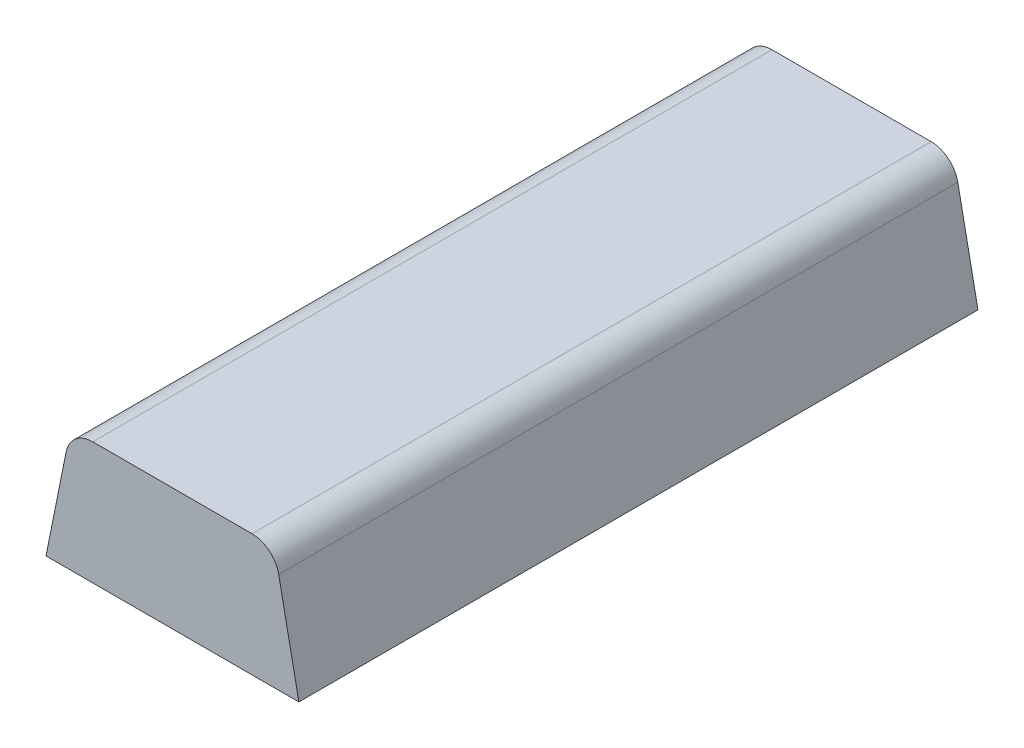
ISO-10303-21;
HEADER;
FILE_DESCRIPTION(('STEP AP214'),'2;1');
FILE_NAME('part.step','',(''),(''),'','','');
FILE_SCHEMA(('AUTOMOTIVE_DESIGN { 1 0 10303 214 1 1 1 1 }'));
ENDSEC;
DATA;
#1=APPLICATION_CONTEXT('core data for automotive mechanical design processes');
#2=APPLICATION_PROTOCOL_DEFINITION('international standard','automotive_design',2000,#1);
#3=PRODUCT_CONTEXT('',#1,'mechanical');
#4=PRODUCT('Part','Part','',(#3));
#5=PRODUCT_RELATED_PRODUCT_CATEGORY('part','',(#4));
#6=PRODUCT_DEFINITION_FORMATION('','',#4);
#7=PRODUCT_DEFINITION_CONTEXT('part definition',#1,'design');
#8=PRODUCT_DEFINITION('design','',#6,#7);
#9=PRODUCT_DEFINITION_SHAPE('','',#8);
#10=(LENGTH_UNIT() NAMED_UNIT(*) SI_UNIT(.MILLI.,.METRE.));
#11=(NAMED_UNIT(*) PLANE_ANGLE_UNIT() SI_UNIT($,.RADIAN.));
#12=(NAMED_UNIT(*) SI_UNIT($,.STERADIAN.) SOLID_ANGLE_UNIT());
#13=UNCERTAINTY_MEASURE_WITH_UNIT(LENGTH_MEASURE(1.E-05),#10,'distance_accuracy_value','');
#14=(GEOMETRIC_REPRESENTATION_CONTEXT(3) GLOBAL_UNCERTAINTY_ASSIGNED_CONTEXT((#13)) GLOBAL_UNIT_ASSIGNED_CONTEXT((#10,
#11,#12)) REPRESENTATION_CONTEXT('',''));
#15=CARTESIAN_POINT('',(0.,0.,0.));
#16=DIRECTION('',(0.,0.,1.));
#17=DIRECTION('',(1.,0.,0.));
#18=AXIS2_PLACEMENT_3D('',#15,#16,#17);
#19=CARTESIAN_POINT('',(2.3447932362444,1.05,0.));
#20=DIRECTION('',(0.,0.,-1.));
#21=DIRECTION('',(-1.,0.,0.));
#22=AXIS2_PLACEMENT_3D('',#19,#20,#21);
#23=CYLINDRICAL_SURFACE('',#22,0.8);
#24=CARTESIAN_POINT('',(2.3447932362444,1.05,10.));
#25=DIRECTION('',(0.,0.,-1.));
#26=DIRECTION('',(-1.,0.,0.));
#27=AXIS2_PLACEMENT_3D('',#24,#25,#26);
#28=CIRCLE('',#27,0.8);
#29=CARTESIAN_POINT('',(2.3447932362444,1.85,10.));
#30=VERTEX_POINT('',#29);
#31=CARTESIAN_POINT('',(3.12910808776642,1.207639505461,10.));
#32=VERTEX_POINT('',#31);
#33=EDGE_CURVE('E78',#30,#32,#28,.T.);
#34=ORIENTED_EDGE('',*,*,#33,.T.);
#35=DIRECTION('',(0.,0.,1.));
#36=VECTOR('',#35,1.);
#37=CARTESIAN_POINT('',(3.12910808776642,1.207639505461,0.));
#38=LINE('',#37,#36);
#39=CARTESIAN_POINT('',(3.12910808776642,1.207639505461,-10.));
#40=VERTEX_POINT('',#39);
#41=EDGE_CURVE('E76',#40,#32,#38,.T.);
#42=ORIENTED_EDGE('',*,*,#41,.F.);
#43=CARTESIAN_POINT('',(2.3447932362444,1.05,-10.));
#44=DIRECTION('',(0.,0.,-1.));
#45=DIRECTION('',(-1.,0.,0.));
#46=AXIS2_PLACEMENT_3D('',#43,#44,#45);
#47=CIRCLE('',#46,0.8);
#48=CARTESIAN_POINT('',(2.3447932362444,1.85,-10.));
#49=VERTEX_POINT('',#48);
#50=EDGE_CURVE('E20',#40,#49,#47,.F.);
#51=ORIENTED_EDGE('',*,*,#50,.T.);
#52=DIRECTION('',(0.,0.,1.));
#53=VECTOR('',#52,1.);
#54=CARTESIAN_POINT('',(2.3447932362444,1.85,0.));
#55=LINE('',#54,#53);
#56=EDGE_CURVE('E73',#30,#49,#55,.F.);
#57=ORIENTED_EDGE('',*,*,#56,.F.);
#58=EDGE_LOOP('',(#34,#42,#51,#57));
#59=FACE_BOUND('',#58,.T.);
#60=ADVANCED_FACE('F17',(#59),#23,.T.);
#61=CARTESIAN_POINT('',(-2.3447932362444,1.05,0.));
#62=DIRECTION('',(0.,0.,1.));
#63=DIRECTION('',(1.,0.,0.));
#64=AXIS2_PLACEMENT_3D('',#61,#62,#63);
#65=CYLINDRICAL_SURFACE('',#64,0.8);
#66=CARTESIAN_POINT('',(-2.3447932362444,1.05,-10.));
#67=DIRECTION('',(0.,0.,1.));
#68=DIRECTION('',(1.,0.,0.));
#69=AXIS2_PLACEMENT_3D('',#66,#67,#68);
#70=CIRCLE('',#69,0.8);
#71=CARTESIAN_POINT('',(-2.3447932362444,1.85,-10.));
#72=VERTEX_POINT('',#71);
#73=CARTESIAN_POINT('',(-3.12910808776642,1.207639505461,-10.));
#74=VERTEX_POINT('',#73);
#75=EDGE_CURVE('E89',#72,#74,#70,.T.);
#76=ORIENTED_EDGE('',*,*,#75,.T.);
#77=DIRECTION('',(0.,0.,1.));
#78=VECTOR('',#77,1.);
#79=CARTESIAN_POINT('',(-3.12910808776642,1.207639505461,0.));
#80=LINE('',#79,#78);
#81=CARTESIAN_POINT('',(-3.12910808776642,1.207639505461,10.));
#82=VERTEX_POINT('',#81);
#83=EDGE_CURVE('E96',#82,#74,#80,.F.);
#84=ORIENTED_EDGE('',*,*,#83,.F.);
#85=CARTESIAN_POINT('',(-2.3447932362444,1.05,10.));
#86=DIRECTION('',(0.,0.,1.));
#87=DIRECTION('',(1.,0.,0.));
#88=AXIS2_PLACEMENT_3D('',#85,#86,#87);
#89=CIRCLE('',#88,0.8);
#90=CARTESIAN_POINT('',(-2.3447932362444,1.85,10.));
#91=VERTEX_POINT('',#90);
#92=EDGE_CURVE('E105',#91,#82,#89,.T.);
#93=ORIENTED_EDGE('',*,*,#92,.F.);
#94=DIRECTION('',(0.,0.,1.));
#95=VECTOR('',#94,1.);
#96=CARTESIAN_POINT('',(-2.3447932362444,1.85,0.));
#97=LINE('',#96,#95);
#98=EDGE_CURVE('E86',#72,#91,#97,.T.);
#99=ORIENTED_EDGE('',*,*,#98,.F.);
#100=EDGE_LOOP('',(#76,#84,#93,#99));
#101=FACE_BOUND('',#100,.T.);
#102=ADVANCED_FACE('F140',(#101),#65,.T.);
#103=CARTESIAN_POINT('',(3.,1.85,0.));
#104=DIRECTION('',(0.,1.,0.));
#105=DIRECTION('',(-1.,0.,0.));
#106=AXIS2_PLACEMENT_3D('',#103,#104,#105);
#107=PLANE('',#106);
#108=ORIENTED_EDGE('',*,*,#56,.T.);
#109=DIRECTION('',(-1.,0.,0.));
#110=VECTOR('',#109,1.);
#111=CARTESIAN_POINT('',(0.,1.85,-10.));
#112=LINE('',#111,#110);
#113=EDGE_CURVE('E83',#72,#49,#112,.F.);
#114=ORIENTED_EDGE('',*,*,#113,.F.);
#115=ORIENTED_EDGE('',*,*,#98,.T.);
#116=DIRECTION('',(1.,0.,0.));
#117=VECTOR('',#116,1.);
#118=CARTESIAN_POINT('',(0.,1.85,10.));
#119=LINE('',#118,#117);
#120=EDGE_CURVE('E85',#30,#91,#119,.F.);
#121=ORIENTED_EDGE('',*,*,#120,.F.);
#122=EDGE_LOOP('',(#108,#114,#115,#121));
#123=FACE_BOUND('',#122,.T.);
#124=ADVANCED_FACE('F81',(#123),#107,.T.);
#125=CARTESIAN_POINT('',(3.72356429125156,-1.75,0.));
#126=DIRECTION('',(0.980393564402527,0.197049381826252,0.));
#127=DIRECTION('',(-0.197049381826252,0.980393564402527,0.));
#128=AXIS2_PLACEMENT_3D('',#125,#126,#127);
#129=PLANE('',#128);
#130=DIRECTION('',(0.,0.,1.));
#131=VECTOR('',#130,1.);
#132=CARTESIAN_POINT('',(3.72356429125156,-1.75,0.));
#133=LINE('',#132,#131);
#134=CARTESIAN_POINT('',(3.72356429125156,-1.75,-10.));
#135=VERTEX_POINT('',#134);
#136=CARTESIAN_POINT('',(3.72356429125156,-1.75,10.));
#137=VERTEX_POINT('',#136);
#138=EDGE_CURVE('E117',#135,#137,#133,.T.);
#139=ORIENTED_EDGE('',*,*,#138,.F.);
#140=DIRECTION('',(0.197049381826252,-0.980393564402527,0.));
#141=VECTOR('',#140,1.);
#142=CARTESIAN_POINT('',(3.12910808776642,1.207639505461,-10.));
#143=LINE('',#142,#141);
#144=EDGE_CURVE('E91',#40,#135,#143,.T.);
#145=ORIENTED_EDGE('',*,*,#144,.F.);
#146=ORIENTED_EDGE('',*,*,#41,.T.);
#147=DIRECTION('',(-0.197049381826252,0.980393564402527,0.));
#148=VECTOR('',#147,1.);
#149=CARTESIAN_POINT('',(3.72356429125156,-1.75,10.));
#150=LINE('',#149,#148);
#151=EDGE_CURVE('E102',#137,#32,#150,.T.);
#152=ORIENTED_EDGE('',*,*,#151,.F.);
#153=EDGE_LOOP('',(#139,#145,#146,#152));
#154=FACE_BOUND('',#153,.T.);
#155=ADVANCED_FACE('F133',(#154),#129,.T.);
#156=CARTESIAN_POINT('',(0.,-0.075285780381972,10.));
#157=DIRECTION('',(0.,0.,1.));
#158=DIRECTION('',(1.,0.,0.));
#159=AXIS2_PLACEMENT_3D('',#156,#157,#158);
#160=PLANE('',#159);
#161=ORIENTED_EDGE('',*,*,#33,.F.);
#162=ORIENTED_EDGE('',*,*,#120,.T.);
#163=ORIENTED_EDGE('',*,*,#92,.T.);
#164=DIRECTION('',(-0.197049381826252,-0.980393564402527,0.));
#165=VECTOR('',#164,1.);
#166=CARTESIAN_POINT('',(-3.,1.85,10.));
#167=LINE('',#166,#165);
#168=CARTESIAN_POINT('',(-3.72356429125156,-1.75,10.));
#169=VERTEX_POINT('',#168);
#170=EDGE_CURVE('E92',#169,#82,#167,.F.);
#171=ORIENTED_EDGE('',*,*,#170,.F.);
#172=DIRECTION('',(1.,0.,0.));
#173=VECTOR('',#172,1.);
#174=CARTESIAN_POINT('',(-3.72356429125156,-1.75,10.));
#175=LINE('',#174,#173);
#176=EDGE_CURVE('E113',#137,#169,#175,.F.);
#177=ORIENTED_EDGE('',*,*,#176,.F.);
#178=ORIENTED_EDGE('',*,*,#151,.T.);
#179=EDGE_LOOP('',(#161,#162,#163,#171,#177,#178));
#180=FACE_BOUND('',#179,.T.);
#181=ADVANCED_FACE('F135',(#180),#160,.T.);
#182=CARTESIAN_POINT('',(-3.,1.85,0.));
#183=DIRECTION('',(-0.980393564402527,0.197049381826252,0.));
#184=DIRECTION('',(-0.197049381826252,-0.980393564402527,0.));
#185=AXIS2_PLACEMENT_3D('',#182,#183,#184);
#186=PLANE('',#185);
#187=DIRECTION('',(0.,0.,1.));
#188=VECTOR('',#187,1.);
#189=CARTESIAN_POINT('',(-3.72356429125156,-1.75,0.));
#190=LINE('',#189,#188);
#191=CARTESIAN_POINT('',(-3.72356429125156,-1.75,-10.));
#192=VERTEX_POINT('',#191);
#193=EDGE_CURVE('E26',#169,#192,#190,.F.);
#194=ORIENTED_EDGE('',*,*,#193,.F.);
#195=ORIENTED_EDGE('',*,*,#170,.T.);
#196=ORIENTED_EDGE('',*,*,#83,.T.);
#197=DIRECTION('',(0.197049381826252,0.980393564402527,0.));
#198=VECTOR('',#197,1.);
#199=CARTESIAN_POINT('',(-3.72356429125156,-1.75,-10.));
#200=LINE('',#199,#198);
#201=EDGE_CURVE('E35',#192,#74,#200,.T.);
#202=ORIENTED_EDGE('',*,*,#201,.F.);
#203=EDGE_LOOP('',(#194,#195,#196,#202));
#204=FACE_BOUND('',#203,.T.);
#205=ADVANCED_FACE('F138',(#204),#186,.T.);
#206=CARTESIAN_POINT('',(0.,-0.075285780381972,-10.));
#207=DIRECTION('',(0.,0.,-1.));
#208=DIRECTION('',(-1.,0.,0.));
#209=AXIS2_PLACEMENT_3D('',#206,#207,#208);
#210=PLANE('',#209);
#211=DIRECTION('',(1.,0.,0.));
#212=VECTOR('',#211,1.);
#213=CARTESIAN_POINT('',(-3.72356429125156,-1.75,-10.));
#214=LINE('',#213,#212);
#215=EDGE_CURVE('E11',#192,#135,#214,.T.);
#216=ORIENTED_EDGE('',*,*,#215,.F.);
#217=ORIENTED_EDGE('',*,*,#201,.T.);
#218=ORIENTED_EDGE('',*,*,#75,.F.);
#219=ORIENTED_EDGE('',*,*,#113,.T.);
#220=ORIENTED_EDGE('',*,*,#50,.F.);
#221=ORIENTED_EDGE('',*,*,#144,.T.);
#222=EDGE_LOOP('',(#216,#217,#218,#219,#220,#221));
#223=FACE_BOUND('',#222,.T.);
#224=ADVANCED_FACE('F88',(#223),#210,.T.);
#225=CARTESIAN_POINT('',(-3.72356429125156,-1.75,0.));
#226=DIRECTION('',(0.,-1.,0.));
#227=DIRECTION('',(1.,0.,0.));
#228=AXIS2_PLACEMENT_3D('',#225,#226,#227);
#229=PLANE('',#228);
#230=ORIENTED_EDGE('',*,*,#193,.T.);
#231=ORIENTED_EDGE('',*,*,#215,.T.);
#232=ORIENTED_EDGE('',*,*,#138,.T.);
#233=ORIENTED_EDGE('',*,*,#176,.T.);
#234=EDGE_LOOP('',(#230,#231,#232,#233));
#235=FACE_BOUND('',#234,.T.);
#236=ADVANCED_FACE('F137',(#235),#229,.T.);
#237=CLOSED_SHELL('',(#60,#102,#124,#155,#181,#205,#224,#236));
#238=MANIFOLD_SOLID_BREP('B1',#237);
#239=ADVANCED_BREP_SHAPE_REPRESENTATION('',(#18,#238),#14);
#240=SHAPE_DEFINITION_REPRESENTATION(#9,#239);
ENDSEC;
END-ISO-10303-21;
